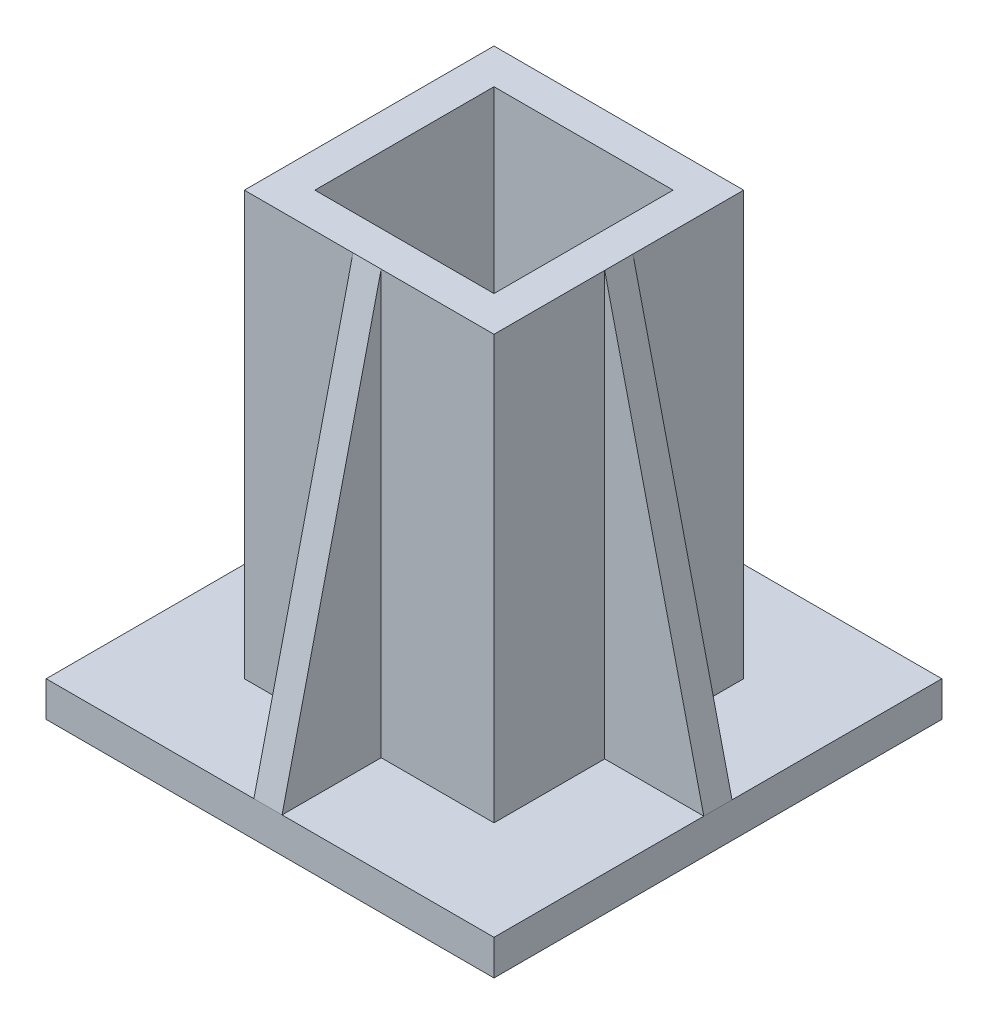
ISO-10303-21;
HEADER;
FILE_DESCRIPTION(('STEP AP214'),'2;1');
FILE_NAME('part.step','',(''),(''),'','','');
FILE_SCHEMA(('AUTOMOTIVE_DESIGN { 1 0 10303 214 1 1 1 1 }'));
ENDSEC;
DATA;
#1=APPLICATION_CONTEXT('core data for automotive mechanical design processes');
#2=APPLICATION_PROTOCOL_DEFINITION('international standard','automotive_design',2000,#1);
#3=PRODUCT_CONTEXT('',#1,'mechanical');
#4=PRODUCT('Part','Part','',(#3));
#5=PRODUCT_RELATED_PRODUCT_CATEGORY('part','',(#4));
#6=PRODUCT_DEFINITION_FORMATION('','',#4);
#7=PRODUCT_DEFINITION_CONTEXT('part definition',#1,'design');
#8=PRODUCT_DEFINITION('design','',#6,#7);
#9=PRODUCT_DEFINITION_SHAPE('','',#8);
#10=(LENGTH_UNIT() NAMED_UNIT(*) SI_UNIT(.MILLI.,.METRE.));
#11=(NAMED_UNIT(*) PLANE_ANGLE_UNIT() SI_UNIT($,.RADIAN.));
#12=(NAMED_UNIT(*) SI_UNIT($,.STERADIAN.) SOLID_ANGLE_UNIT());
#13=UNCERTAINTY_MEASURE_WITH_UNIT(LENGTH_MEASURE(1.E-05),#10,'distance_accuracy_value','');
#14=(GEOMETRIC_REPRESENTATION_CONTEXT(3) GLOBAL_UNCERTAINTY_ASSIGNED_CONTEXT((#13)) GLOBAL_UNIT_ASSIGNED_CONTEXT((#10,
#11,#12)) REPRESENTATION_CONTEXT('',''));
#15=CARTESIAN_POINT('',(0.,0.,0.));
#16=DIRECTION('',(0.,0.,1.));
#17=DIRECTION('',(1.,0.,0.));
#18=AXIS2_PLACEMENT_3D('',#15,#16,#17);
#19=CARTESIAN_POINT('',(0.,5.,0.));
#20=DIRECTION('',(0.,-1.,0.));
#21=DIRECTION('',(0.,0.,-1.));
#22=AXIS2_PLACEMENT_3D('',#19,#20,#21);
#23=PLANE('',#22);
#24=DIRECTION('',(0.,0.,1.));
#25=VECTOR('',#24,1.);
#26=CARTESIAN_POINT('',(-2.3,5.,17.7));
#27=LINE('',#26,#25);
#28=CARTESIAN_POINT('',(-2.3,5.,17.7));
#29=VERTEX_POINT('',#28);
#30=CARTESIAN_POINT('',(-2.3,5.,31.75));
#31=VERTEX_POINT('',#30);
#32=EDGE_CURVE('E195',#29,#31,#27,.T.);
#33=ORIENTED_EDGE('',*,*,#32,.F.);
#34=DIRECTION('',(1.,0.,0.));
#35=VECTOR('',#34,1.);
#36=CARTESIAN_POINT('',(17.7,5.,17.7));
#37=LINE('',#36,#35);
#38=CARTESIAN_POINT('',(-17.7,5.,17.7));
#39=VERTEX_POINT('',#38);
#40=EDGE_CURVE('E205',#39,#29,#37,.T.);
#41=ORIENTED_EDGE('',*,*,#40,.F.);
#42=DIRECTION('',(0.,0.,1.));
#43=VECTOR('',#42,1.);
#44=CARTESIAN_POINT('',(-17.7,5.,17.7));
#45=LINE('',#44,#43);
#46=CARTESIAN_POINT('',(-17.7,5.,2.));
#47=VERTEX_POINT('',#46);
#48=EDGE_CURVE('E230',#47,#39,#45,.T.);
#49=ORIENTED_EDGE('',*,*,#48,.F.);
#50=DIRECTION('',(1.,0.,0.));
#51=VECTOR('',#50,1.);
#52=CARTESIAN_POINT('',(-31.75,5.,2.));
#53=LINE('',#52,#51);
#54=CARTESIAN_POINT('',(-31.75,5.,2.));
#55=VERTEX_POINT('',#54);
#56=EDGE_CURVE('E323',#55,#47,#53,.T.);
#57=ORIENTED_EDGE('',*,*,#56,.F.);
#58=DIRECTION('',(0.,0.,1.));
#59=VECTOR('',#58,1.);
#60=CARTESIAN_POINT('',(-31.75,5.,-31.75));
#61=LINE('',#60,#59);
#62=CARTESIAN_POINT('',(-31.75,5.,31.75));
#63=VERTEX_POINT('',#62);
#64=EDGE_CURVE('E248',#55,#63,#61,.T.);
#65=ORIENTED_EDGE('',*,*,#64,.T.);
#66=DIRECTION('',(1.,0.,0.));
#67=VECTOR('',#66,1.);
#68=CARTESIAN_POINT('',(31.75,5.,31.75));
#69=LINE('',#68,#67);
#70=EDGE_CURVE('E249',#63,#31,#69,.T.);
#71=ORIENTED_EDGE('',*,*,#70,.T.);
#72=EDGE_LOOP('',(#33,#41,#49,#57,#65,#71));
#73=FACE_BOUND('',#72,.T.);
#74=ADVANCED_FACE('F33',(#73),#23,.F.);
#75=DIRECTION('',(0.,0.,-1.));
#76=VECTOR('',#75,1.);
#77=CARTESIAN_POINT('',(1.7,5.,17.7));
#78=LINE('',#77,#76);
#79=CARTESIAN_POINT('',(1.7,5.,31.75));
#80=VERTEX_POINT('',#79);
#81=CARTESIAN_POINT('',(1.7,5.,17.7));
#82=VERTEX_POINT('',#81);
#83=EDGE_CURVE('E207',#80,#82,#78,.T.);
#84=ORIENTED_EDGE('',*,*,#83,.F.);
#85=CARTESIAN_POINT('',(31.75,5.,31.75));
#86=VERTEX_POINT('',#85);
#87=EDGE_CURVE('E247',#80,#86,#69,.T.);
#88=ORIENTED_EDGE('',*,*,#87,.T.);
#89=DIRECTION('',(0.,0.,-1.));
#90=VECTOR('',#89,1.);
#91=CARTESIAN_POINT('',(31.75,5.,-31.75));
#92=LINE('',#91,#90);
#93=CARTESIAN_POINT('',(31.75,5.,2.));
#94=VERTEX_POINT('',#93);
#95=EDGE_CURVE('E252',#86,#94,#92,.T.);
#96=ORIENTED_EDGE('',*,*,#95,.T.);
#97=DIRECTION('',(1.,0.,0.));
#98=VECTOR('',#97,1.);
#99=CARTESIAN_POINT('',(17.7,5.,2.));
#100=LINE('',#99,#98);
#101=CARTESIAN_POINT('',(17.7,5.,2.));
#102=VERTEX_POINT('',#101);
#103=EDGE_CURVE('E307',#102,#94,#100,.T.);
#104=ORIENTED_EDGE('',*,*,#103,.F.);
#105=DIRECTION('',(0.,0.,-1.));
#106=VECTOR('',#105,1.);
#107=CARTESIAN_POINT('',(17.7,5.,17.7));
#108=LINE('',#107,#106);
#109=CARTESIAN_POINT('',(17.7,5.,17.7));
#110=VERTEX_POINT('',#109);
#111=EDGE_CURVE('E224',#110,#102,#108,.T.);
#112=ORIENTED_EDGE('',*,*,#111,.F.);
#113=EDGE_CURVE('E234',#82,#110,#37,.T.);
#114=ORIENTED_EDGE('',*,*,#113,.F.);
#115=EDGE_LOOP('',(#84,#88,#96,#104,#112,#114));
#116=FACE_BOUND('',#115,.T.);
#117=ADVANCED_FACE('F404',(#116),#23,.F.);
#118=CARTESIAN_POINT('',(17.7,65.,17.7));
#119=DIRECTION('',(0.,0.,-1.));
#120=DIRECTION('',(-1.,0.,0.));
#121=AXIS2_PLACEMENT_3D('',#118,#119,#120);
#122=PLANE('',#121);
#123=DIRECTION('',(0.,-1.,0.));
#124=VECTOR('',#123,1.);
#125=CARTESIAN_POINT('',(-2.3,65.,17.7));
#126=LINE('',#125,#124);
#127=CARTESIAN_POINT('',(-2.3,65.,17.7));
#128=VERTEX_POINT('',#127);
#129=EDGE_CURVE('E193',#128,#29,#126,.T.);
#130=ORIENTED_EDGE('',*,*,#129,.F.);
#131=DIRECTION('',(1.,0.,0.));
#132=VECTOR('',#131,1.);
#133=CARTESIAN_POINT('',(17.7,65.,17.7));
#134=LINE('',#133,#132);
#135=CARTESIAN_POINT('',(-17.7,65.,17.7));
#136=VERTEX_POINT('',#135);
#137=EDGE_CURVE('E203',#136,#128,#134,.T.);
#138=ORIENTED_EDGE('',*,*,#137,.F.);
#139=DIRECTION('',(0.,-1.,0.));
#140=VECTOR('',#139,1.);
#141=CARTESIAN_POINT('',(-17.7,65.,17.7));
#142=LINE('',#141,#140);
#143=EDGE_CURVE('E218',#136,#39,#142,.T.);
#144=ORIENTED_EDGE('',*,*,#143,.T.);
#145=ORIENTED_EDGE('',*,*,#40,.T.);
#146=EDGE_LOOP('',(#130,#138,#144,#145));
#147=FACE_BOUND('',#146,.T.);
#148=ADVANCED_FACE('F201',(#147),#122,.F.);
#149=DIRECTION('',(0.,-1.,0.));
#150=VECTOR('',#149,1.);
#151=CARTESIAN_POINT('',(1.7,65.,17.7));
#152=LINE('',#151,#150);
#153=CARTESIAN_POINT('',(1.70000000000001,65.,17.7));
#154=VERTEX_POINT('',#153);
#155=EDGE_CURVE('E206',#154,#82,#152,.T.);
#156=ORIENTED_EDGE('',*,*,#155,.T.);
#157=ORIENTED_EDGE('',*,*,#113,.T.);
#158=DIRECTION('',(0.,-1.,0.));
#159=VECTOR('',#158,1.);
#160=CARTESIAN_POINT('',(17.7,65.,17.7));
#161=LINE('',#160,#159);
#162=CARTESIAN_POINT('',(17.7,65.,17.7));
#163=VERTEX_POINT('',#162);
#164=EDGE_CURVE('E214',#163,#110,#161,.T.);
#165=ORIENTED_EDGE('',*,*,#164,.F.);
#166=EDGE_CURVE('E215',#154,#163,#134,.T.);
#167=ORIENTED_EDGE('',*,*,#166,.F.);
#168=EDGE_LOOP('',(#156,#157,#165,#167));
#169=FACE_BOUND('',#168,.T.);
#170=ADVANCED_FACE('F428',(#169),#122,.F.);
#171=DIRECTION('',(-1.,0.,0.));
#172=VECTOR('',#171,1.);
#173=CARTESIAN_POINT('',(17.7,5.,-2.));
#174=LINE('',#173,#172);
#175=CARTESIAN_POINT('',(31.75,5.,-2.));
#176=VERTEX_POINT('',#175);
#177=CARTESIAN_POINT('',(17.7,5.,-2.));
#178=VERTEX_POINT('',#177);
#179=EDGE_CURVE('E310',#176,#178,#174,.T.);
#180=ORIENTED_EDGE('',*,*,#179,.F.);
#181=CARTESIAN_POINT('',(31.75,5.,-31.75));
#182=VERTEX_POINT('',#181);
#183=EDGE_CURVE('E251',#176,#182,#92,.T.);
#184=ORIENTED_EDGE('',*,*,#183,.T.);
#185=DIRECTION('',(-1.,0.,0.));
#186=VECTOR('',#185,1.);
#187=CARTESIAN_POINT('',(31.75,5.,-31.75));
#188=LINE('',#187,#186);
#189=CARTESIAN_POINT('',(-31.75,5.,-31.75));
#190=VERTEX_POINT('',#189);
#191=EDGE_CURVE('E255',#182,#190,#188,.T.);
#192=ORIENTED_EDGE('',*,*,#191,.T.);
#193=CARTESIAN_POINT('',(-31.75,5.,-2.));
#194=VERTEX_POINT('',#193);
#195=EDGE_CURVE('E245',#190,#194,#61,.T.);
#196=ORIENTED_EDGE('',*,*,#195,.T.);
#197=DIRECTION('',(-1.,0.,0.));
#198=VECTOR('',#197,1.);
#199=CARTESIAN_POINT('',(-31.75,5.,-2.));
#200=LINE('',#199,#198);
#201=CARTESIAN_POINT('',(-17.7,5.,-2.));
#202=VERTEX_POINT('',#201);
#203=EDGE_CURVE('E325',#202,#194,#200,.T.);
#204=ORIENTED_EDGE('',*,*,#203,.F.);
#205=CARTESIAN_POINT('',(-17.7,5.,-17.7));
#206=VERTEX_POINT('',#205);
#207=EDGE_CURVE('E231',#206,#202,#45,.T.);
#208=ORIENTED_EDGE('',*,*,#207,.F.);
#209=DIRECTION('',(-1.,0.,0.));
#210=VECTOR('',#209,1.);
#211=CARTESIAN_POINT('',(17.7,5.,-17.7));
#212=LINE('',#211,#210);
#213=CARTESIAN_POINT('',(17.7,5.,-17.7));
#214=VERTEX_POINT('',#213);
#215=EDGE_CURVE('E227',#214,#206,#212,.T.);
#216=ORIENTED_EDGE('',*,*,#215,.F.);
#217=EDGE_CURVE('E58',#178,#214,#108,.T.);
#218=ORIENTED_EDGE('',*,*,#217,.F.);
#219=EDGE_LOOP('',(#180,#184,#192,#196,#204,#208,#216,#218));
#220=FACE_BOUND('',#219,.T.);
#221=ADVANCED_FACE('F411',(#220),#23,.F.);
#222=CARTESIAN_POINT('',(17.7,65.,17.7));
#223=DIRECTION('',(-1.,0.,0.));
#224=DIRECTION('',(0.,0.,1.));
#225=AXIS2_PLACEMENT_3D('',#222,#223,#224);
#226=PLANE('',#225);
#227=DIRECTION('',(0.,-1.,0.));
#228=VECTOR('',#227,1.);
#229=CARTESIAN_POINT('',(17.7,65.,2.));
#230=LINE('',#229,#228);
#231=CARTESIAN_POINT('',(17.7,65.,2.));
#232=VERTEX_POINT('',#231);
#233=EDGE_CURVE('E314',#232,#102,#230,.T.);
#234=ORIENTED_EDGE('',*,*,#233,.F.);
#235=DIRECTION('',(0.,0.,-1.));
#236=VECTOR('',#235,1.);
#237=CARTESIAN_POINT('',(17.7,65.,17.7));
#238=LINE('',#237,#236);
#239=EDGE_CURVE('E363',#163,#232,#238,.T.);
#240=ORIENTED_EDGE('',*,*,#239,.F.);
#241=ORIENTED_EDGE('',*,*,#164,.T.);
#242=ORIENTED_EDGE('',*,*,#111,.T.);
#243=EDGE_LOOP('',(#234,#240,#241,#242));
#244=FACE_BOUND('',#243,.T.);
#245=ADVANCED_FACE('F427',(#244),#226,.F.);
#246=DIRECTION('',(0.,-1.,0.));
#247=VECTOR('',#246,1.);
#248=CARTESIAN_POINT('',(17.7,65.,-2.));
#249=LINE('',#248,#247);
#250=CARTESIAN_POINT('',(17.7,65.,-2.));
#251=VERTEX_POINT('',#250);
#252=EDGE_CURVE('E312',#251,#178,#249,.T.);
#253=ORIENTED_EDGE('',*,*,#252,.T.);
#254=ORIENTED_EDGE('',*,*,#217,.T.);
#255=DIRECTION('',(0.,-1.,0.));
#256=VECTOR('',#255,1.);
#257=CARTESIAN_POINT('',(17.7,65.,-17.7));
#258=LINE('',#257,#256);
#259=CARTESIAN_POINT('',(17.7,65.,-17.7));
#260=VERTEX_POINT('',#259);
#261=EDGE_CURVE('E241',#260,#214,#258,.T.);
#262=ORIENTED_EDGE('',*,*,#261,.F.);
#263=EDGE_CURVE('E235',#251,#260,#238,.T.);
#264=ORIENTED_EDGE('',*,*,#263,.F.);
#265=EDGE_LOOP('',(#253,#254,#262,#264));
#266=FACE_BOUND('',#265,.T.);
#267=ADVANCED_FACE('F434',(#266),#226,.F.);
#268=CARTESIAN_POINT('',(-31.75,5.,-31.75));
#269=DIRECTION('',(1.,0.,0.));
#270=DIRECTION('',(0.,0.,-1.));
#271=AXIS2_PLACEMENT_3D('',#268,#269,#270);
#272=PLANE('',#271);
#273=DIRECTION('',(0.,0.,-1.));
#274=VECTOR('',#273,1.);
#275=CARTESIAN_POINT('',(-31.75,5.,140.572521626764));
#276=LINE('',#275,#274);
#277=EDGE_CURVE('E316',#55,#194,#276,.T.);
#278=ORIENTED_EDGE('',*,*,#277,.T.);
#279=ORIENTED_EDGE('',*,*,#195,.F.);
#280=DIRECTION('',(0.,-1.,0.));
#281=VECTOR('',#280,1.);
#282=CARTESIAN_POINT('',(-31.75,5.,-31.75));
#283=LINE('',#282,#281);
#284=CARTESIAN_POINT('',(-31.75,0.,-31.75));
#285=VERTEX_POINT('',#284);
#286=EDGE_CURVE('E257',#190,#285,#283,.T.);
#287=ORIENTED_EDGE('',*,*,#286,.T.);
#288=DIRECTION('',(0.,0.,1.));
#289=VECTOR('',#288,1.);
#290=CARTESIAN_POINT('',(-31.75,0.,-31.75));
#291=LINE('',#290,#289);
#292=CARTESIAN_POINT('',(-31.75,0.,31.75));
#293=VERTEX_POINT('',#292);
#294=EDGE_CURVE('E244',#285,#293,#291,.T.);
#295=ORIENTED_EDGE('',*,*,#294,.T.);
#296=DIRECTION('',(0.,-1.,0.));
#297=VECTOR('',#296,1.);
#298=CARTESIAN_POINT('',(-31.75,5.,31.75));
#299=LINE('',#298,#297);
#300=EDGE_CURVE('E274',#63,#293,#299,.T.);
#301=ORIENTED_EDGE('',*,*,#300,.F.);
#302=ORIENTED_EDGE('',*,*,#64,.F.);
#303=EDGE_LOOP('',(#278,#279,#287,#295,#301,#302));
#304=FACE_BOUND('',#303,.T.);
#305=ADVANCED_FACE('F35',(#304),#272,.F.);
#306=CARTESIAN_POINT('',(0.,65.,0.));
#307=DIRECTION('',(0.,1.,0.));
#308=DIRECTION('',(0.,0.,1.));
#309=AXIS2_PLACEMENT_3D('',#306,#307,#308);
#310=PLANE('',#309);
#311=DIRECTION('',(1.,0.,0.));
#312=VECTOR('',#311,1.);
#313=CARTESIAN_POINT('',(-140.872521626764,65.,17.7));
#314=LINE('',#313,#312);
#315=EDGE_CURVE('E180',#128,#154,#314,.T.);
#316=ORIENTED_EDGE('',*,*,#315,.T.);
#317=ORIENTED_EDGE('',*,*,#166,.T.);
#318=ORIENTED_EDGE('',*,*,#239,.T.);
#319=DIRECTION('',(0.,0.,-1.));
#320=VECTOR('',#319,1.);
#321=CARTESIAN_POINT('',(17.7,65.,140.572521626764));
#322=LINE('',#321,#320);
#323=EDGE_CURVE('E300',#232,#251,#322,.T.);
#324=ORIENTED_EDGE('',*,*,#323,.T.);
#325=ORIENTED_EDGE('',*,*,#263,.T.);
#326=DIRECTION('',(-1.,0.,0.));
#327=VECTOR('',#326,1.);
#328=CARTESIAN_POINT('',(17.7,65.,-17.7));
#329=LINE('',#328,#327);
#330=CARTESIAN_POINT('',(-17.7,65.,-17.7));
#331=VERTEX_POINT('',#330);
#332=EDGE_CURVE('E365',#260,#331,#329,.T.);
#333=ORIENTED_EDGE('',*,*,#332,.T.);
#334=DIRECTION('',(0.,0.,1.));
#335=VECTOR('',#334,1.);
#336=CARTESIAN_POINT('',(-17.7,65.,17.7));
#337=LINE('',#336,#335);
#338=CARTESIAN_POINT('',(-17.7,65.,-2.));
#339=VERTEX_POINT('',#338);
#340=EDGE_CURVE('E220',#331,#339,#337,.T.);
#341=ORIENTED_EDGE('',*,*,#340,.T.);
#342=DIRECTION('',(0.,0.,-1.));
#343=VECTOR('',#342,1.);
#344=CARTESIAN_POINT('',(-17.7,65.,140.572521626764));
#345=LINE('',#344,#343);
#346=CARTESIAN_POINT('',(-17.7,65.,2.));
#347=VERTEX_POINT('',#346);
#348=EDGE_CURVE('E50',#347,#339,#345,.T.);
#349=ORIENTED_EDGE('',*,*,#348,.F.);
#350=EDGE_CURVE('E212',#347,#136,#337,.T.);
#351=ORIENTED_EDGE('',*,*,#350,.T.);
#352=ORIENTED_EDGE('',*,*,#137,.T.);
#353=EDGE_LOOP('',(#316,#317,#318,#324,#325,#333,#341,#349,#351,#352));
#354=FACE_BOUND('',#353,.T.);
#355=DIRECTION('',(1.,0.,0.));
#356=VECTOR('',#355,1.);
#357=CARTESIAN_POINT('',(12.7,65.,12.7));
#358=LINE('',#357,#356);
#359=CARTESIAN_POINT('',(-12.7,65.,12.7));
#360=VERTEX_POINT('',#359);
#361=CARTESIAN_POINT('',(12.7,65.,12.7));
#362=VERTEX_POINT('',#361);
#363=EDGE_CURVE('E336',#360,#362,#358,.T.);
#364=ORIENTED_EDGE('',*,*,#363,.F.);
#365=DIRECTION('',(0.,0.,1.));
#366=VECTOR('',#365,1.);
#367=CARTESIAN_POINT('',(-12.7,65.,12.7));
#368=LINE('',#367,#366);
#369=CARTESIAN_POINT('',(-12.7,65.,-12.7));
#370=VERTEX_POINT('',#369);
#371=EDGE_CURVE('E334',#370,#360,#368,.T.);
#372=ORIENTED_EDGE('',*,*,#371,.F.);
#373=DIRECTION('',(-1.,0.,0.));
#374=VECTOR('',#373,1.);
#375=CARTESIAN_POINT('',(12.7,65.,-12.7));
#376=LINE('',#375,#374);
#377=CARTESIAN_POINT('',(12.7,65.,-12.7));
#378=VERTEX_POINT('',#377);
#379=EDGE_CURVE('E342',#378,#370,#376,.T.);
#380=ORIENTED_EDGE('',*,*,#379,.F.);
#381=DIRECTION('',(0.,0.,-1.));
#382=VECTOR('',#381,1.);
#383=CARTESIAN_POINT('',(12.7,65.,12.7));
#384=LINE('',#383,#382);
#385=EDGE_CURVE('E339',#362,#378,#384,.T.);
#386=ORIENTED_EDGE('',*,*,#385,.F.);
#387=EDGE_LOOP('',(#364,#372,#380,#386));
#388=FACE_BOUND('',#387,.T.);
#389=ADVANCED_FACE('F209',(#354,#388),#310,.T.);
#390=CARTESIAN_POINT('',(-31.75,65.,2.));
#391=DIRECTION('',(0.,0.,-1.));
#392=DIRECTION('',(-1.,0.,0.));
#393=AXIS2_PLACEMENT_3D('',#390,#391,#392);
#394=PLANE('',#393);
#395=DIRECTION('',(0.227999034679754,0.973661358063008,0.));
#396=VECTOR('',#395,1.);
#397=CARTESIAN_POINT('',(-18.4303690153993,61.880986411106,2.));
#398=LINE('',#397,#396);
#399=EDGE_CURVE('E318',#55,#347,#398,.T.);
#400=ORIENTED_EDGE('',*,*,#399,.F.);
#401=ORIENTED_EDGE('',*,*,#56,.T.);
#402=DIRECTION('',(0.,-1.,0.));
#403=VECTOR('',#402,1.);
#404=CARTESIAN_POINT('',(-17.7,65.,2.));
#405=LINE('',#404,#403);
#406=EDGE_CURVE('E330',#347,#47,#405,.T.);
#407=ORIENTED_EDGE('',*,*,#406,.F.);
#408=EDGE_LOOP('',(#400,#401,#407));
#409=FACE_BOUND('',#408,.T.);
#410=ADVANCED_FACE('F376',(#409),#394,.F.);
#411=CARTESIAN_POINT('',(-31.75,65.,-2.));
#412=DIRECTION('',(0.,0.,1.));
#413=DIRECTION('',(1.,0.,0.));
#414=AXIS2_PLACEMENT_3D('',#411,#412,#413);
#415=PLANE('',#414);
#416=DIRECTION('',(-0.227999034679754,-0.973661358063008,0.));
#417=VECTOR('',#416,1.);
#418=CARTESIAN_POINT('',(-18.4303690153993,61.880986411106,-2.));
#419=LINE('',#418,#417);
#420=EDGE_CURVE('E277',#339,#194,#419,.T.);
#421=ORIENTED_EDGE('',*,*,#420,.F.);
#422=DIRECTION('',(0.,-1.,0.));
#423=VECTOR('',#422,1.);
#424=CARTESIAN_POINT('',(-17.7,65.,-2.));
#425=LINE('',#424,#423);
#426=EDGE_CURVE('E328',#339,#202,#425,.T.);
#427=ORIENTED_EDGE('',*,*,#426,.T.);
#428=ORIENTED_EDGE('',*,*,#203,.T.);
#429=EDGE_LOOP('',(#421,#427,#428));
#430=FACE_BOUND('',#429,.T.);
#431=ADVANCED_FACE('F393',(#430),#415,.F.);
#432=CARTESIAN_POINT('',(-17.7,65.,17.7));
#433=DIRECTION('',(1.,0.,0.));
#434=DIRECTION('',(0.,0.,-1.));
#435=AXIS2_PLACEMENT_3D('',#432,#433,#434);
#436=PLANE('',#435);
#437=ORIENTED_EDGE('',*,*,#406,.T.);
#438=ORIENTED_EDGE('',*,*,#48,.T.);
#439=ORIENTED_EDGE('',*,*,#143,.F.);
#440=ORIENTED_EDGE('',*,*,#350,.F.);
#441=EDGE_LOOP('',(#437,#438,#439,#440));
#442=FACE_BOUND('',#441,.T.);
#443=ADVANCED_FACE('F390',(#442),#436,.F.);
#444=ORIENTED_EDGE('',*,*,#426,.F.);
#445=ORIENTED_EDGE('',*,*,#340,.F.);
#446=DIRECTION('',(0.,-1.,0.));
#447=VECTOR('',#446,1.);
#448=CARTESIAN_POINT('',(-17.7,65.,-17.7));
#449=LINE('',#448,#447);
#450=EDGE_CURVE('E238',#331,#206,#449,.T.);
#451=ORIENTED_EDGE('',*,*,#450,.T.);
#452=ORIENTED_EDGE('',*,*,#207,.T.);
#453=EDGE_LOOP('',(#444,#445,#451,#452));
#454=FACE_BOUND('',#453,.T.);
#455=ADVANCED_FACE('F392',(#454),#436,.F.);
#456=CARTESIAN_POINT('',(31.75,5.,31.75));
#457=DIRECTION('',(0.,0.,-1.));
#458=DIRECTION('',(-1.,0.,0.));
#459=AXIS2_PLACEMENT_3D('',#456,#457,#458);
#460=PLANE('',#459);
#461=ORIENTED_EDGE('',*,*,#87,.F.);
#462=DIRECTION('',(1.,0.,0.));
#463=VECTOR('',#462,1.);
#464=CARTESIAN_POINT('',(-140.872521626764,5.,31.75));
#465=LINE('',#464,#463);
#466=EDGE_CURVE('E187',#31,#80,#465,.T.);
#467=ORIENTED_EDGE('',*,*,#466,.F.);
#468=ORIENTED_EDGE('',*,*,#70,.F.);
#469=ORIENTED_EDGE('',*,*,#300,.T.);
#470=DIRECTION('',(1.,0.,0.));
#471=VECTOR('',#470,1.);
#472=CARTESIAN_POINT('',(31.75,0.,31.75));
#473=LINE('',#472,#471);
#474=CARTESIAN_POINT('',(31.75,0.,31.75));
#475=VERTEX_POINT('',#474);
#476=EDGE_CURVE('E260',#293,#475,#473,.T.);
#477=ORIENTED_EDGE('',*,*,#476,.T.);
#478=DIRECTION('',(0.,-1.,0.));
#479=VECTOR('',#478,1.);
#480=CARTESIAN_POINT('',(31.75,5.,31.75));
#481=LINE('',#480,#479);
#482=EDGE_CURVE('E271',#86,#475,#481,.T.);
#483=ORIENTED_EDGE('',*,*,#482,.F.);
#484=EDGE_LOOP('',(#461,#467,#468,#469,#477,#483));
#485=FACE_BOUND('',#484,.T.);
#486=ADVANCED_FACE('F387',(#485),#460,.F.);
#487=CARTESIAN_POINT('',(31.75,5.,-31.75));
#488=DIRECTION('',(-1.,0.,0.));
#489=DIRECTION('',(0.,0.,1.));
#490=AXIS2_PLACEMENT_3D('',#487,#488,#489);
#491=PLANE('',#490);
#492=ORIENTED_EDGE('',*,*,#183,.F.);
#493=DIRECTION('',(0.,0.,-1.));
#494=VECTOR('',#493,1.);
#495=CARTESIAN_POINT('',(31.75,5.,140.572521626764));
#496=LINE('',#495,#494);
#497=EDGE_CURVE('E299',#94,#176,#496,.T.);
#498=ORIENTED_EDGE('',*,*,#497,.F.);
#499=ORIENTED_EDGE('',*,*,#95,.F.);
#500=ORIENTED_EDGE('',*,*,#482,.T.);
#501=DIRECTION('',(0.,0.,-1.));
#502=VECTOR('',#501,1.);
#503=CARTESIAN_POINT('',(31.75,0.,-31.75));
#504=LINE('',#503,#502);
#505=CARTESIAN_POINT('',(31.75,0.,-31.75));
#506=VERTEX_POINT('',#505);
#507=EDGE_CURVE('E262',#475,#506,#504,.T.);
#508=ORIENTED_EDGE('',*,*,#507,.T.);
#509=DIRECTION('',(0.,-1.,0.));
#510=VECTOR('',#509,1.);
#511=CARTESIAN_POINT('',(31.75,5.,-31.75));
#512=LINE('',#511,#510);
#513=EDGE_CURVE('E268',#182,#506,#512,.T.);
#514=ORIENTED_EDGE('',*,*,#513,.F.);
#515=EDGE_LOOP('',(#492,#498,#499,#500,#508,#514));
#516=FACE_BOUND('',#515,.T.);
#517=ADVANCED_FACE('F444',(#516),#491,.F.);
#518=CARTESIAN_POINT('',(31.75,5.,-31.75));
#519=DIRECTION('',(0.,0.,1.));
#520=DIRECTION('',(1.,0.,0.));
#521=AXIS2_PLACEMENT_3D('',#518,#519,#520);
#522=PLANE('',#521);
#523=DIRECTION('',(-1.,0.,0.));
#524=VECTOR('',#523,1.);
#525=CARTESIAN_POINT('',(31.75,0.,-31.75));
#526=LINE('',#525,#524);
#527=EDGE_CURVE('E264',#506,#285,#526,.T.);
#528=ORIENTED_EDGE('',*,*,#527,.T.);
#529=ORIENTED_EDGE('',*,*,#286,.F.);
#530=ORIENTED_EDGE('',*,*,#191,.F.);
#531=ORIENTED_EDGE('',*,*,#513,.T.);
#532=EDGE_LOOP('',(#528,#529,#530,#531));
#533=FACE_BOUND('',#532,.T.);
#534=ADVANCED_FACE('F451',(#533),#522,.F.);
#535=CARTESIAN_POINT('',(0.,0.,0.));
#536=DIRECTION('',(0.,-1.,0.));
#537=DIRECTION('',(0.,0.,-1.));
#538=AXIS2_PLACEMENT_3D('',#535,#536,#537);
#539=PLANE('',#538);
#540=ORIENTED_EDGE('',*,*,#294,.F.);
#541=ORIENTED_EDGE('',*,*,#527,.F.);
#542=ORIENTED_EDGE('',*,*,#507,.F.);
#543=ORIENTED_EDGE('',*,*,#476,.F.);
#544=EDGE_LOOP('',(#540,#541,#542,#543));
#545=FACE_BOUND('',#544,.T.);
#546=ADVANCED_FACE('F468',(#545),#539,.T.);
#547=CARTESIAN_POINT('',(17.7,65.,-17.7));
#548=DIRECTION('',(0.,0.,1.));
#549=DIRECTION('',(1.,0.,0.));
#550=AXIS2_PLACEMENT_3D('',#547,#548,#549);
#551=PLANE('',#550);
#552=CARTESIAN_POINT('',(0.,47.4664440189098,-17.7));
#553=DIRECTION('',(0.,0.,-1.));
#554=DIRECTION('',(-1.,0.,0.));
#555=AXIS2_PLACEMENT_3D('',#552,#553,#554);
#556=CIRCLE('',#555,3.175);
#557=CARTESIAN_POINT('',(-3.175,47.4664440189098,-17.7));
#558=VERTEX_POINT('',#557);
#559=EDGE_CURVE('E292',#558,#558,#556,.T.);
#560=ORIENTED_EDGE('',*,*,#559,.F.);
#561=EDGE_LOOP('',(#560));
#562=FACE_BOUND('',#561,.T.);
#563=CARTESIAN_POINT('',(0.,17.7393658676567,-17.7));
#564=DIRECTION('',(0.,0.,-1.));
#565=DIRECTION('',(-1.,0.,0.));
#566=AXIS2_PLACEMENT_3D('',#563,#564,#565);
#567=CIRCLE('',#566,3.175);
#568=CARTESIAN_POINT('',(-3.175,17.7393658676567,-17.7));
#569=VERTEX_POINT('',#568);
#570=EDGE_CURVE('E283',#569,#569,#567,.T.);
#571=ORIENTED_EDGE('',*,*,#570,.F.);
#572=EDGE_LOOP('',(#571));
#573=FACE_BOUND('',#572,.T.);
#574=ORIENTED_EDGE('',*,*,#215,.T.);
#575=ORIENTED_EDGE('',*,*,#450,.F.);
#576=ORIENTED_EDGE('',*,*,#332,.F.);
#577=ORIENTED_EDGE('',*,*,#261,.T.);
#578=EDGE_LOOP('',(#574,#575,#576,#577));
#579=FACE_BOUND('',#578,.T.);
#580=ADVANCED_FACE('F454',(#562,#573,#579),#551,.F.);
#581=CARTESIAN_POINT('',(-12.7,65.,12.7));
#582=DIRECTION('',(1.,0.,0.));
#583=DIRECTION('',(0.,0.,-1.));
#584=AXIS2_PLACEMENT_3D('',#581,#582,#583);
#585=PLANE('',#584);
#586=DIRECTION('',(0.,0.,1.));
#587=VECTOR('',#586,1.);
#588=CARTESIAN_POINT('',(-12.7,5.,12.7));
#589=LINE('',#588,#587);
#590=CARTESIAN_POINT('',(-12.7,5.,-12.7));
#591=VERTEX_POINT('',#590);
#592=CARTESIAN_POINT('',(-12.7,5.,12.7));
#593=VERTEX_POINT('',#592);
#594=EDGE_CURVE('E333',#591,#593,#589,.T.);
#595=ORIENTED_EDGE('',*,*,#594,.F.);
#596=DIRECTION('',(0.,-1.,0.));
#597=VECTOR('',#596,1.);
#598=CARTESIAN_POINT('',(-12.7,65.,-12.7));
#599=LINE('',#598,#597);
#600=EDGE_CURVE('E344',#370,#591,#599,.T.);
#601=ORIENTED_EDGE('',*,*,#600,.F.);
#602=ORIENTED_EDGE('',*,*,#371,.T.);
#603=DIRECTION('',(0.,-1.,0.));
#604=VECTOR('',#603,1.);
#605=CARTESIAN_POINT('',(-12.7,65.,12.7));
#606=LINE('',#605,#604);
#607=EDGE_CURVE('E360',#360,#593,#606,.T.);
#608=ORIENTED_EDGE('',*,*,#607,.T.);
#609=EDGE_LOOP('',(#595,#601,#602,#608));
#610=FACE_BOUND('',#609,.T.);
#611=ADVANCED_FACE('F474',(#610),#585,.T.);
#612=CARTESIAN_POINT('',(12.7,65.,12.7));
#613=DIRECTION('',(0.,0.,-1.));
#614=DIRECTION('',(-1.,0.,0.));
#615=AXIS2_PLACEMENT_3D('',#612,#613,#614);
#616=PLANE('',#615);
#617=DIRECTION('',(1.,0.,0.));
#618=VECTOR('',#617,1.);
#619=CARTESIAN_POINT('',(12.7,5.,12.7));
#620=LINE('',#619,#618);
#621=CARTESIAN_POINT('',(12.7,5.,12.7));
#622=VERTEX_POINT('',#621);
#623=EDGE_CURVE('E347',#593,#622,#620,.T.);
#624=ORIENTED_EDGE('',*,*,#623,.F.);
#625=ORIENTED_EDGE('',*,*,#607,.F.);
#626=ORIENTED_EDGE('',*,*,#363,.T.);
#627=DIRECTION('',(0.,-1.,0.));
#628=VECTOR('',#627,1.);
#629=CARTESIAN_POINT('',(12.7,65.,12.7));
#630=LINE('',#629,#628);
#631=EDGE_CURVE('E358',#362,#622,#630,.T.);
#632=ORIENTED_EDGE('',*,*,#631,.T.);
#633=EDGE_LOOP('',(#624,#625,#626,#632));
#634=FACE_BOUND('',#633,.T.);
#635=ADVANCED_FACE('F512',(#634),#616,.T.);
#636=CARTESIAN_POINT('',(12.7,65.,12.7));
#637=DIRECTION('',(-1.,0.,0.));
#638=DIRECTION('',(0.,0.,1.));
#639=AXIS2_PLACEMENT_3D('',#636,#637,#638);
#640=PLANE('',#639);
#641=DIRECTION('',(0.,0.,-1.));
#642=VECTOR('',#641,1.);
#643=CARTESIAN_POINT('',(12.7,5.,12.7));
#644=LINE('',#643,#642);
#645=CARTESIAN_POINT('',(12.7,5.,-12.7));
#646=VERTEX_POINT('',#645);
#647=EDGE_CURVE('E350',#622,#646,#644,.T.);
#648=ORIENTED_EDGE('',*,*,#647,.F.);
#649=ORIENTED_EDGE('',*,*,#631,.F.);
#650=ORIENTED_EDGE('',*,*,#385,.T.);
#651=DIRECTION('',(0.,-1.,0.));
#652=VECTOR('',#651,1.);
#653=CARTESIAN_POINT('',(12.7,65.,-12.7));
#654=LINE('',#653,#652);
#655=EDGE_CURVE('E356',#378,#646,#654,.T.);
#656=ORIENTED_EDGE('',*,*,#655,.T.);
#657=EDGE_LOOP('',(#648,#649,#650,#656));
#658=FACE_BOUND('',#657,.T.);
#659=ADVANCED_FACE('F423',(#658),#640,.T.);
#660=CARTESIAN_POINT('',(12.7,65.,-12.7));
#661=DIRECTION('',(0.,0.,1.));
#662=DIRECTION('',(1.,0.,0.));
#663=AXIS2_PLACEMENT_3D('',#660,#661,#662);
#664=PLANE('',#663);
#665=CARTESIAN_POINT('',(0.,47.4664440189098,-12.7));
#666=DIRECTION('',(0.,0.,1.));
#667=DIRECTION('',(1.,0.,0.));
#668=AXIS2_PLACEMENT_3D('',#665,#666,#667);
#669=CIRCLE('',#668,3.175);
#670=CARTESIAN_POINT('',(3.175,47.4664440189098,-12.7));
#671=VERTEX_POINT('',#670);
#672=EDGE_CURVE('E37',#671,#671,#669,.T.);
#673=ORIENTED_EDGE('',*,*,#672,.F.);
#674=EDGE_LOOP('',(#673));
#675=FACE_BOUND('',#674,.T.);
#676=CARTESIAN_POINT('',(0.,17.7393658676567,-12.7));
#677=DIRECTION('',(0.,0.,1.));
#678=DIRECTION('',(1.,0.,0.));
#679=AXIS2_PLACEMENT_3D('',#676,#677,#678);
#680=CIRCLE('',#679,3.175);
#681=CARTESIAN_POINT('',(3.175,17.7393658676567,-12.7));
#682=VERTEX_POINT('',#681);
#683=EDGE_CURVE('E281',#682,#682,#680,.T.);
#684=ORIENTED_EDGE('',*,*,#683,.F.);
#685=EDGE_LOOP('',(#684));
#686=FACE_BOUND('',#685,.T.);
#687=DIRECTION('',(-1.,0.,0.));
#688=VECTOR('',#687,1.);
#689=CARTESIAN_POINT('',(12.7,5.,-12.7));
#690=LINE('',#689,#688);
#691=EDGE_CURVE('E337',#646,#591,#690,.T.);
#692=ORIENTED_EDGE('',*,*,#691,.F.);
#693=ORIENTED_EDGE('',*,*,#655,.F.);
#694=ORIENTED_EDGE('',*,*,#379,.T.);
#695=ORIENTED_EDGE('',*,*,#600,.T.);
#696=EDGE_LOOP('',(#692,#693,#694,#695));
#697=FACE_BOUND('',#696,.T.);
#698=ADVANCED_FACE('F415',(#675,#686,#697),#664,.T.);
#699=ORIENTED_EDGE('',*,*,#691,.T.);
#700=ORIENTED_EDGE('',*,*,#594,.T.);
#701=ORIENTED_EDGE('',*,*,#623,.T.);
#702=ORIENTED_EDGE('',*,*,#647,.T.);
#703=EDGE_LOOP('',(#699,#700,#701,#702));
#704=FACE_BOUND('',#703,.T.);
#705=ADVANCED_FACE('F406',(#704),#23,.F.);
#706=CARTESIAN_POINT('',(-31.75,5.,140.572521626764));
#707=DIRECTION('',(-0.973661358063007,0.227999034679754,0.));
#708=DIRECTION('',(-0.227999034679754,-0.973661358063008,0.));
#709=AXIS2_PLACEMENT_3D('',#706,#707,#708);
#710=PLANE('',#709);
#711=ORIENTED_EDGE('',*,*,#277,.F.);
#712=ORIENTED_EDGE('',*,*,#399,.T.);
#713=ORIENTED_EDGE('',*,*,#348,.T.);
#714=ORIENTED_EDGE('',*,*,#420,.T.);
#715=EDGE_LOOP('',(#711,#712,#713,#714));
#716=FACE_BOUND('',#715,.T.);
#717=ADVANCED_FACE('F373',(#716),#710,.T.);
#718=CARTESIAN_POINT('',(17.7,65.,2.));
#719=DIRECTION('',(0.,0.,-1.));
#720=DIRECTION('',(-1.,0.,0.));
#721=AXIS2_PLACEMENT_3D('',#718,#719,#720);
#722=PLANE('',#721);
#723=ORIENTED_EDGE('',*,*,#103,.T.);
#724=DIRECTION('',(-0.227999034679754,0.973661358063008,0.));
#725=VECTOR('',#724,1.);
#726=CARTESIAN_POINT('',(17.7,65.,2.));
#727=LINE('',#726,#725);
#728=EDGE_CURVE('E303',#94,#232,#727,.T.);
#729=ORIENTED_EDGE('',*,*,#728,.T.);
#730=ORIENTED_EDGE('',*,*,#233,.T.);
#731=EDGE_LOOP('',(#723,#729,#730));
#732=FACE_BOUND('',#731,.T.);
#733=ADVANCED_FACE('F421',(#732),#722,.F.);
#734=CARTESIAN_POINT('',(17.7,65.,-2.));
#735=DIRECTION('',(0.,0.,1.));
#736=DIRECTION('',(1.,0.,0.));
#737=AXIS2_PLACEMENT_3D('',#734,#735,#736);
#738=PLANE('',#737);
#739=ORIENTED_EDGE('',*,*,#252,.F.);
#740=DIRECTION('',(0.227999034679754,-0.973661358063008,0.));
#741=VECTOR('',#740,1.);
#742=CARTESIAN_POINT('',(17.7,65.,-2.));
#743=LINE('',#742,#741);
#744=EDGE_CURVE('E42',#251,#176,#743,.T.);
#745=ORIENTED_EDGE('',*,*,#744,.T.);
#746=ORIENTED_EDGE('',*,*,#179,.T.);
#747=EDGE_LOOP('',(#739,#745,#746));
#748=FACE_BOUND('',#747,.T.);
#749=ADVANCED_FACE('F458',(#748),#738,.F.);
#750=CARTESIAN_POINT('',(31.75,5.,140.572521626764));
#751=DIRECTION('',(-0.973661358063007,-0.227999034679754,0.));
#752=DIRECTION('',(0.227999034679754,-0.973661358063008,0.));
#753=AXIS2_PLACEMENT_3D('',#750,#751,#752);
#754=PLANE('',#753);
#755=ORIENTED_EDGE('',*,*,#728,.F.);
#756=ORIENTED_EDGE('',*,*,#497,.T.);
#757=ORIENTED_EDGE('',*,*,#744,.F.);
#758=ORIENTED_EDGE('',*,*,#323,.F.);
#759=EDGE_LOOP('',(#755,#756,#757,#758));
#760=FACE_BOUND('',#759,.T.);
#761=ADVANCED_FACE('F459',(#760),#754,.F.);
#762=CARTESIAN_POINT('',(-2.3,65.,17.7));
#763=DIRECTION('',(1.,0.,0.));
#764=DIRECTION('',(0.,0.,-1.));
#765=AXIS2_PLACEMENT_3D('',#762,#763,#764);
#766=PLANE('',#765);
#767=ORIENTED_EDGE('',*,*,#32,.T.);
#768=DIRECTION('',(0.,0.973661358063008,-0.227999034679754));
#769=VECTOR('',#768,1.);
#770=CARTESIAN_POINT('',(-2.3,65.,17.7));
#771=LINE('',#770,#769);
#772=EDGE_CURVE('E183',#31,#128,#771,.T.);
#773=ORIENTED_EDGE('',*,*,#772,.T.);
#774=ORIENTED_EDGE('',*,*,#129,.T.);
#775=EDGE_LOOP('',(#767,#773,#774));
#776=FACE_BOUND('',#775,.T.);
#777=ADVANCED_FACE('F192',(#776),#766,.F.);
#778=CARTESIAN_POINT('',(1.7,65.,17.7));
#779=DIRECTION('',(-1.,0.,0.));
#780=DIRECTION('',(0.,0.,1.));
#781=AXIS2_PLACEMENT_3D('',#778,#779,#780);
#782=PLANE('',#781);
#783=ORIENTED_EDGE('',*,*,#155,.F.);
#784=DIRECTION('',(0.,-0.973661358063008,0.227999034679754));
#785=VECTOR('',#784,1.);
#786=CARTESIAN_POINT('',(1.7,65.,17.7));
#787=LINE('',#786,#785);
#788=EDGE_CURVE('E11',#154,#80,#787,.T.);
#789=ORIENTED_EDGE('',*,*,#788,.T.);
#790=ORIENTED_EDGE('',*,*,#83,.T.);
#791=EDGE_LOOP('',(#783,#789,#790));
#792=FACE_BOUND('',#791,.T.);
#793=ADVANCED_FACE('F654',(#792),#782,.F.);
#794=CARTESIAN_POINT('',(-140.872521626764,5.,31.75));
#795=DIRECTION('',(0.,-0.227999034679754,-0.973661358063007));
#796=DIRECTION('',(0.,0.973661358063008,-0.227999034679754));
#797=AXIS2_PLACEMENT_3D('',#794,#795,#796);
#798=PLANE('',#797);
#799=ORIENTED_EDGE('',*,*,#772,.F.);
#800=ORIENTED_EDGE('',*,*,#466,.T.);
#801=ORIENTED_EDGE('',*,*,#788,.F.);
#802=ORIENTED_EDGE('',*,*,#315,.F.);
#803=EDGE_LOOP('',(#799,#800,#801,#802));
#804=FACE_BOUND('',#803,.T.);
#805=ADVANCED_FACE('F182',(#804),#798,.F.);
#806=CARTESIAN_POINT('',(0.,17.7393658676567,2.30000000000001));
#807=DIRECTION('',(0.,0.,-1.));
#808=DIRECTION('',(-1.,0.,0.));
#809=AXIS2_PLACEMENT_3D('',#806,#807,#808);
#810=CYLINDRICAL_SURFACE('',#809,3.175);
#811=ORIENTED_EDGE('',*,*,#683,.T.);
#812=EDGE_LOOP('',(#811));
#813=FACE_BOUND('',#812,.T.);
#814=ORIENTED_EDGE('',*,*,#570,.T.);
#815=EDGE_LOOP('',(#814));
#816=FACE_BOUND('',#815,.T.);
#817=ADVANCED_FACE('F660',(#813,#816),#810,.F.);
#818=CARTESIAN_POINT('',(0.,47.4664440189098,2.30000000000001));
#819=DIRECTION('',(0.,0.,-1.));
#820=DIRECTION('',(-1.,0.,0.));
#821=AXIS2_PLACEMENT_3D('',#818,#819,#820);
#822=CYLINDRICAL_SURFACE('',#821,3.175);
#823=ORIENTED_EDGE('',*,*,#672,.T.);
#824=EDGE_LOOP('',(#823));
#825=FACE_BOUND('',#824,.T.);
#826=ORIENTED_EDGE('',*,*,#559,.T.);
#827=EDGE_LOOP('',(#826));
#828=FACE_BOUND('',#827,.T.);
#829=ADVANCED_FACE('F663',(#825,#828),#822,.F.);
#830=CLOSED_SHELL('',(#74,#117,#148,#170,#221,#245,#267,#305,#389,#410,#431,#443,#455,#486,#517,
#534,#546,#580,#611,#635,#659,#698,#705,#717,#733,#749,#761,#777,#793,#805,#817,#829));
#831=MANIFOLD_SOLID_BREP('B2',#830);
#832=ADVANCED_BREP_SHAPE_REPRESENTATION('',(#18,#831),#14);
#833=SHAPE_DEFINITION_REPRESENTATION(#9,#832);
ENDSEC;
END-ISO-10303-21;
